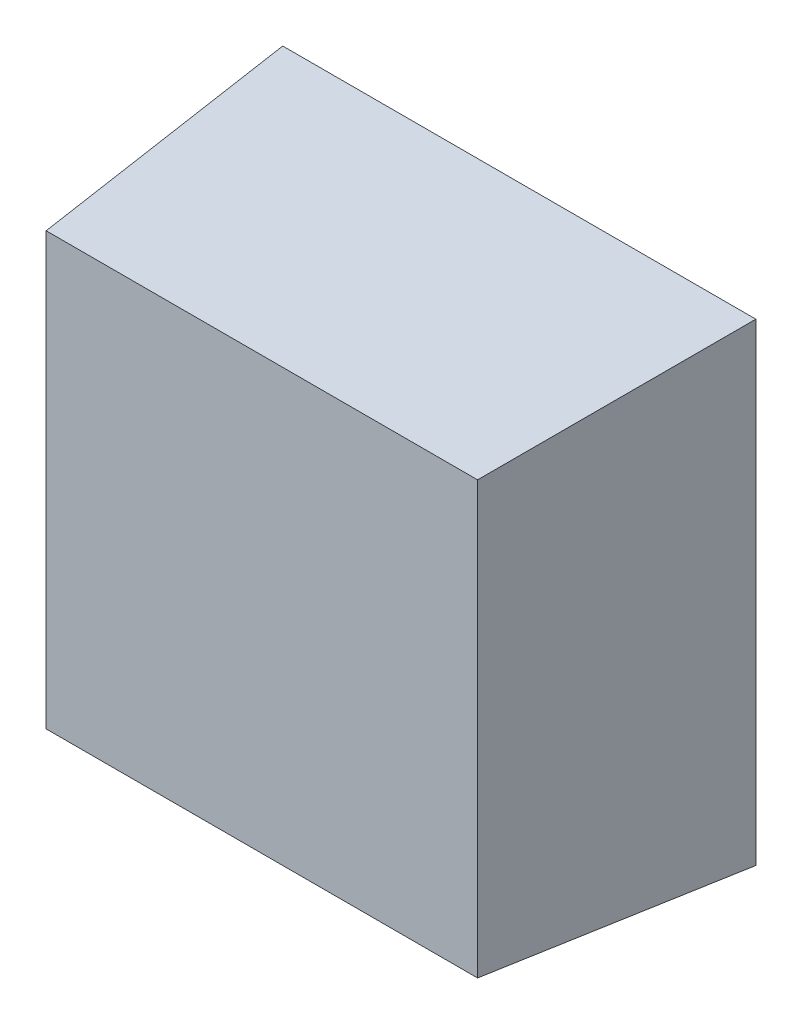
ISO-10303-21;
HEADER;
FILE_DESCRIPTION(('STEP AP214'),'2;1');
FILE_NAME('part.step','',(''),(''),'','','');
FILE_SCHEMA(('AUTOMOTIVE_DESIGN { 1 0 10303 214 1 1 1 1 }'));
ENDSEC;
DATA;
#1=APPLICATION_CONTEXT('core data for automotive mechanical design processes');
#2=APPLICATION_PROTOCOL_DEFINITION('international standard','automotive_design',2000,#1);
#3=PRODUCT_CONTEXT('',#1,'mechanical');
#4=PRODUCT('Part','Part','',(#3));
#5=PRODUCT_RELATED_PRODUCT_CATEGORY('part','',(#4));
#6=PRODUCT_DEFINITION_FORMATION('','',#4);
#7=PRODUCT_DEFINITION_CONTEXT('part definition',#1,'design');
#8=PRODUCT_DEFINITION('design','',#6,#7);
#9=PRODUCT_DEFINITION_SHAPE('','',#8);
#10=(LENGTH_UNIT() NAMED_UNIT(*) SI_UNIT(.MILLI.,.METRE.));
#11=(NAMED_UNIT(*) PLANE_ANGLE_UNIT() SI_UNIT($,.RADIAN.));
#12=(NAMED_UNIT(*) SI_UNIT($,.STERADIAN.) SOLID_ANGLE_UNIT());
#13=UNCERTAINTY_MEASURE_WITH_UNIT(LENGTH_MEASURE(1.E-05),#10,'distance_accuracy_value','');
#14=(GEOMETRIC_REPRESENTATION_CONTEXT(3) GLOBAL_UNCERTAINTY_ASSIGNED_CONTEXT((#13)) GLOBAL_UNIT_ASSIGNED_CONTEXT((#10,
#11,#12)) REPRESENTATION_CONTEXT('',''));
#15=CARTESIAN_POINT('',(0.,0.,0.));
#16=DIRECTION('',(0.,0.,1.));
#17=DIRECTION('',(1.,0.,0.));
#18=AXIS2_PLACEMENT_3D('',#15,#16,#17);
#19=CARTESIAN_POINT('',(0.,0.,20.));
#20=DIRECTION('',(1.,0.,0.));
#21=DIRECTION('',(0.,0.,-1.));
#22=AXIS2_PLACEMENT_3D('',#19,#20,#21);
#23=PLANE('',#22);
#24=DIRECTION('',(0.,-1.,0.));
#25=VECTOR('',#24,1.);
#26=CARTESIAN_POINT('',(0.,0.,0.));
#27=LINE('',#26,#25);
#28=CARTESIAN_POINT('',(0.,40.,0.));
#29=VERTEX_POINT('',#28);
#30=CARTESIAN_POINT('',(0.,0.,0.));
#31=VERTEX_POINT('',#30);
#32=EDGE_CURVE('E91',#29,#31,#27,.T.);
#33=ORIENTED_EDGE('',*,*,#32,.T.);
#34=DIRECTION('',(0.,0.,-1.));
#35=VECTOR('',#34,1.);
#36=CARTESIAN_POINT('',(0.,0.,20.));
#37=LINE('',#36,#35);
#38=CARTESIAN_POINT('',(0.,0.,20.));
#39=VERTEX_POINT('',#38);
#40=EDGE_CURVE('E11',#39,#31,#37,.T.);
#41=ORIENTED_EDGE('',*,*,#40,.F.);
#42=DIRECTION('',(0.,-1.,0.));
#43=VECTOR('',#42,1.);
#44=CARTESIAN_POINT('',(0.,0.,20.));
#45=LINE('',#44,#43);
#46=CARTESIAN_POINT('',(0.,36.4734603858307,20.));
#47=VERTEX_POINT('',#46);
#48=EDGE_CURVE('E82',#47,#39,#45,.T.);
#49=ORIENTED_EDGE('',*,*,#48,.F.);
#50=DIRECTION('',(0.,-0.17364817766693,0.984807753012208));
#51=VECTOR('',#50,1.);
#52=CARTESIAN_POINT('',(0.,35.3736509824615,26.2373290743725));
#53=LINE('',#52,#51);
#54=EDGE_CURVE('E39',#47,#29,#53,.F.);
#55=ORIENTED_EDGE('',*,*,#54,.T.);
#56=EDGE_LOOP('',(#33,#41,#49,#55));
#57=FACE_BOUND('',#56,.T.);
#58=ADVANCED_FACE('F35',(#57),#23,.F.);
#59=CARTESIAN_POINT('',(0.,0.,20.));
#60=DIRECTION('',(0.,1.,0.));
#61=DIRECTION('',(0.,0.,1.));
#62=AXIS2_PLACEMENT_3D('',#59,#60,#61);
#63=PLANE('',#62);
#64=DIRECTION('',(1.,0.,0.));
#65=VECTOR('',#64,1.);
#66=CARTESIAN_POINT('',(0.,0.,0.));
#67=LINE('',#66,#65);
#68=CARTESIAN_POINT('',(40.,0.,0.));
#69=VERTEX_POINT('',#68);
#70=EDGE_CURVE('E94',#31,#69,#67,.T.);
#71=ORIENTED_EDGE('',*,*,#70,.T.);
#72=DIRECTION('',(-0.17364817766693,0.,0.984807753012208));
#73=VECTOR('',#72,1.);
#74=CARTESIAN_POINT('',(40.,0.,0.));
#75=LINE('',#74,#73);
#76=CARTESIAN_POINT('',(36.4734603858307,0.,20.));
#77=VERTEX_POINT('',#76);
#78=EDGE_CURVE('E44',#77,#69,#75,.F.);
#79=ORIENTED_EDGE('',*,*,#78,.F.);
#80=DIRECTION('',(1.,0.,0.));
#81=VECTOR('',#80,1.);
#82=CARTESIAN_POINT('',(0.,0.,20.));
#83=LINE('',#82,#81);
#84=EDGE_CURVE('E77',#39,#77,#83,.T.);
#85=ORIENTED_EDGE('',*,*,#84,.F.);
#86=ORIENTED_EDGE('',*,*,#40,.T.);
#87=EDGE_LOOP('',(#71,#79,#85,#86));
#88=FACE_BOUND('',#87,.T.);
#89=ADVANCED_FACE('F78',(#88),#63,.F.);
#90=CARTESIAN_POINT('',(40.,0.,0.));
#91=DIRECTION('',(0.984807753012208,0.,0.17364817766693));
#92=DIRECTION('',(0.17364817766693,0.,-0.984807753012208));
#93=AXIS2_PLACEMENT_3D('',#90,#91,#92);
#94=PLANE('',#93);
#95=DIRECTION('',(0.,1.,0.));
#96=VECTOR('',#95,1.);
#97=CARTESIAN_POINT('',(40.,0.,0.));
#98=LINE('',#97,#96);
#99=CARTESIAN_POINT('',(40.,40.,0.));
#100=VERTEX_POINT('',#99);
#101=EDGE_CURVE('E96',#69,#100,#98,.T.);
#102=ORIENTED_EDGE('',*,*,#101,.T.);
#103=DIRECTION('',(0.171087869746036,0.171087869746036,-0.970287525247814));
#104=VECTOR('',#103,1.);
#105=CARTESIAN_POINT('',(38.8291576330305,38.8291576330305,6.64017702943204));
#106=LINE('',#105,#104);
#107=CARTESIAN_POINT('',(36.4734603858307,36.4734603858307,20.));
#108=VERTEX_POINT('',#107);
#109=EDGE_CURVE('E101',#108,#100,#106,.T.);
#110=ORIENTED_EDGE('',*,*,#109,.F.);
#111=DIRECTION('',(0.,-1.,0.));
#112=VECTOR('',#111,1.);
#113=CARTESIAN_POINT('',(36.4734603858307,0.,20.));
#114=LINE('',#113,#112);
#115=EDGE_CURVE('E57',#77,#108,#114,.F.);
#116=ORIENTED_EDGE('',*,*,#115,.F.);
#117=ORIENTED_EDGE('',*,*,#78,.T.);
#118=EDGE_LOOP('',(#102,#110,#116,#117));
#119=FACE_BOUND('',#118,.T.);
#120=ADVANCED_FACE('F37',(#119),#94,.T.);
#121=CARTESIAN_POINT('',(0.,40.,0.));
#122=DIRECTION('',(0.,0.984807753012208,0.17364817766693));
#123=DIRECTION('',(0.,-0.17364817766693,0.984807753012208));
#124=AXIS2_PLACEMENT_3D('',#121,#122,#123);
#125=PLANE('',#124);
#126=DIRECTION('',(-1.,0.,0.));
#127=VECTOR('',#126,1.);
#128=CARTESIAN_POINT('',(0.,40.,0.));
#129=LINE('',#128,#127);
#130=EDGE_CURVE('E88',#100,#29,#129,.T.);
#131=ORIENTED_EDGE('',*,*,#130,.T.);
#132=ORIENTED_EDGE('',*,*,#54,.F.);
#133=DIRECTION('',(1.,0.,0.));
#134=VECTOR('',#133,1.);
#135=CARTESIAN_POINT('',(0.,36.4734603858307,20.));
#136=LINE('',#135,#134);
#137=EDGE_CURVE('E52',#108,#47,#136,.F.);
#138=ORIENTED_EDGE('',*,*,#137,.F.);
#139=ORIENTED_EDGE('',*,*,#109,.T.);
#140=EDGE_LOOP('',(#131,#132,#138,#139));
#141=FACE_BOUND('',#140,.T.);
#142=ADVANCED_FACE('F109',(#141),#125,.T.);
#143=CARTESIAN_POINT('',(0.,0.,20.));
#144=DIRECTION('',(0.,0.,-1.));
#145=DIRECTION('',(-1.,0.,0.));
#146=AXIS2_PLACEMENT_3D('',#143,#144,#145);
#147=PLANE('',#146);
#148=ORIENTED_EDGE('',*,*,#48,.T.);
#149=ORIENTED_EDGE('',*,*,#84,.T.);
#150=ORIENTED_EDGE('',*,*,#115,.T.);
#151=ORIENTED_EDGE('',*,*,#137,.T.);
#152=EDGE_LOOP('',(#148,#149,#150,#151));
#153=FACE_BOUND('',#152,.T.);
#154=ADVANCED_FACE('F85',(#153),#147,.F.);
#155=CARTESIAN_POINT('',(0.,0.,0.));
#156=DIRECTION('',(0.,0.,-1.));
#157=DIRECTION('',(-1.,0.,0.));
#158=AXIS2_PLACEMENT_3D('',#155,#156,#157);
#159=PLANE('',#158);
#160=ORIENTED_EDGE('',*,*,#32,.F.);
#161=ORIENTED_EDGE('',*,*,#130,.F.);
#162=ORIENTED_EDGE('',*,*,#101,.F.);
#163=ORIENTED_EDGE('',*,*,#70,.F.);
#164=EDGE_LOOP('',(#160,#161,#162,#163));
#165=FACE_BOUND('',#164,.T.);
#166=ADVANCED_FACE('F107',(#165),#159,.T.);
#167=CLOSED_SHELL('',(#58,#89,#120,#142,#154,#166));
#168=MANIFOLD_SOLID_BREP('B2',#167);
#169=ADVANCED_BREP_SHAPE_REPRESENTATION('',(#18,#168),#14);
#170=SHAPE_DEFINITION_REPRESENTATION(#9,#169);
ENDSEC;
END-ISO-10303-21;
